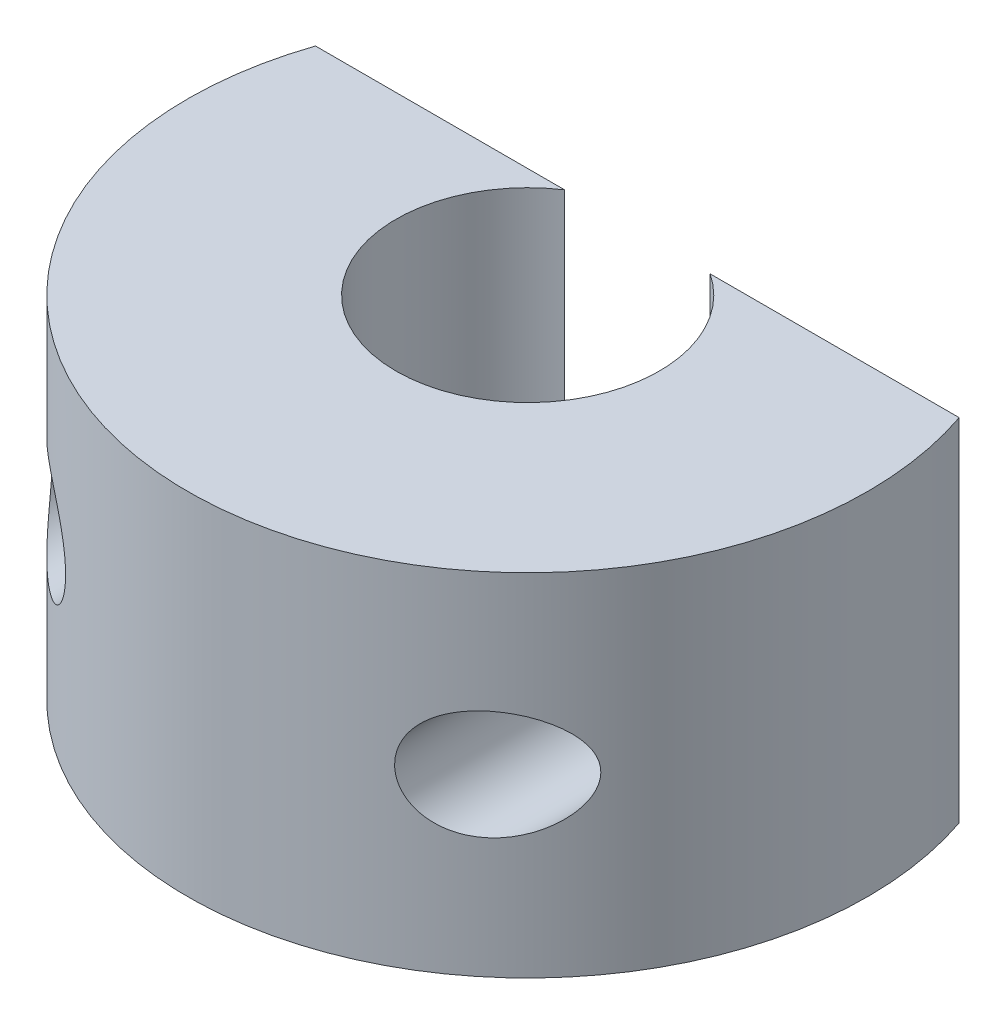
ISO-10303-21;
HEADER;
FILE_DESCRIPTION(('STEP AP214'),'2;1');
FILE_NAME('part.step','',(''),(''),'','','');
FILE_SCHEMA(('AUTOMOTIVE_DESIGN { 1 0 10303 214 1 1 1 1 }'));
ENDSEC;
DATA;
#1=APPLICATION_CONTEXT('core data for automotive mechanical design processes');
#2=APPLICATION_PROTOCOL_DEFINITION('international standard','automotive_design',2000,#1);
#3=PRODUCT_CONTEXT('',#1,'mechanical');
#4=PRODUCT('Part','Part','',(#3));
#5=PRODUCT_RELATED_PRODUCT_CATEGORY('part','',(#4));
#6=PRODUCT_DEFINITION_FORMATION('','',#4);
#7=PRODUCT_DEFINITION_CONTEXT('part definition',#1,'design');
#8=PRODUCT_DEFINITION('design','',#6,#7);
#9=PRODUCT_DEFINITION_SHAPE('','',#8);
#10=(LENGTH_UNIT() NAMED_UNIT(*) SI_UNIT(.MILLI.,.METRE.));
#11=(NAMED_UNIT(*) PLANE_ANGLE_UNIT() SI_UNIT($,.RADIAN.));
#12=(NAMED_UNIT(*) SI_UNIT($,.STERADIAN.) SOLID_ANGLE_UNIT());
#13=UNCERTAINTY_MEASURE_WITH_UNIT(LENGTH_MEASURE(1.E-05),#10,'distance_accuracy_value','');
#14=(GEOMETRIC_REPRESENTATION_CONTEXT(3) GLOBAL_UNCERTAINTY_ASSIGNED_CONTEXT((#13)) GLOBAL_UNIT_ASSIGNED_CONTEXT((#10,
#11,#12)) REPRESENTATION_CONTEXT('',''));
#15=CARTESIAN_POINT('',(0.,0.,0.));
#16=DIRECTION('',(0.,0.,1.));
#17=DIRECTION('',(1.,0.,0.));
#18=AXIS2_PLACEMENT_3D('',#15,#16,#17);
#19=CARTESIAN_POINT('',(0.,4.,0.));
#20=DIRECTION('',(0.,-1.,0.));
#21=DIRECTION('',(0.,0.,-1.));
#22=AXIS2_PLACEMENT_3D('',#19,#20,#21);
#23=CYLINDRICAL_SURFACE('',#22,3.);
#24=CARTESIAN_POINT('',(0.,-4.,0.));
#25=DIRECTION('',(0.,-1.,0.));
#26=DIRECTION('',(0.,0.,-1.));
#27=AXIS2_PLACEMENT_3D('',#24,#25,#26);
#28=CIRCLE('',#27,3.);
#29=CARTESIAN_POINT('',(1.6583123951777,-4.,-2.5));
#30=VERTEX_POINT('',#29);
#31=CARTESIAN_POINT('',(-1.6583123951777,-4.,-2.5));
#32=VERTEX_POINT('',#31);
#33=EDGE_CURVE('E102',#30,#32,#28,.T.);
#34=ORIENTED_EDGE('',*,*,#33,.T.);
#35=DIRECTION('',(0.,-1.,0.));
#36=VECTOR('',#35,1.);
#37=CARTESIAN_POINT('',(-1.6583123951777,4.,-2.5));
#38=LINE('',#37,#36);
#39=CARTESIAN_POINT('',(-1.6583123951777,4.,-2.5));
#40=VERTEX_POINT('',#39);
#41=EDGE_CURVE('E11',#40,#32,#38,.T.);
#42=ORIENTED_EDGE('',*,*,#41,.F.);
#43=CARTESIAN_POINT('',(0.,4.,0.));
#44=DIRECTION('',(0.,-1.,0.));
#45=DIRECTION('',(0.,0.,-1.));
#46=AXIS2_PLACEMENT_3D('',#43,#44,#45);
#47=CIRCLE('',#46,3.);
#48=CARTESIAN_POINT('',(1.6583123951777,4.,-2.5));
#49=VERTEX_POINT('',#48);
#50=EDGE_CURVE('E89',#49,#40,#47,.T.);
#51=ORIENTED_EDGE('',*,*,#50,.F.);
#52=DIRECTION('',(0.,-1.,0.));
#53=VECTOR('',#52,1.);
#54=CARTESIAN_POINT('',(1.6583123951777,4.,-2.5));
#55=LINE('',#54,#53);
#56=EDGE_CURVE('E98',#49,#30,#55,.T.);
#57=ORIENTED_EDGE('',*,*,#56,.T.);
#58=EDGE_LOOP('',(#34,#42,#51,#57));
#59=FACE_BOUND('',#58,.T.);
#60=ADVANCED_FACE('F32',(#59),#23,.F.);
#61=CARTESIAN_POINT('',(-7.3357003755606,4.,-2.5));
#62=DIRECTION('',(0.,0.,1.));
#63=DIRECTION('',(1.,0.,0.));
#64=AXIS2_PLACEMENT_3D('',#61,#62,#63);
#65=PLANE('',#64);
#66=CARTESIAN_POINT('',(-5.,0.,-2.49999999999999));
#67=DIRECTION('',(0.,0.,-1.));
#68=DIRECTION('',(-1.,0.,0.));
#69=AXIS2_PLACEMENT_3D('',#66,#67,#68);
#70=CIRCLE('',#69,1.25);
#71=CARTESIAN_POINT('',(-6.25,0.,-2.49999999999999));
#72=VERTEX_POINT('',#71);
#73=EDGE_CURVE('E152',#72,#72,#70,.T.);
#74=ORIENTED_EDGE('',*,*,#73,.F.);
#75=EDGE_LOOP('',(#74));
#76=FACE_BOUND('',#75,.T.);
#77=DIRECTION('',(-1.,0.,0.));
#78=VECTOR('',#77,1.);
#79=CARTESIAN_POINT('',(-7.3357003755606,-4.,-2.5));
#80=LINE('',#79,#78);
#81=CARTESIAN_POINT('',(-7.3357003755606,-4.,-2.5));
#82=VERTEX_POINT('',#81);
#83=EDGE_CURVE('E93',#32,#82,#80,.T.);
#84=ORIENTED_EDGE('',*,*,#83,.T.);
#85=DIRECTION('',(0.,-1.,0.));
#86=VECTOR('',#85,1.);
#87=CARTESIAN_POINT('',(-7.3357003755606,4.,-2.5));
#88=LINE('',#87,#86);
#89=CARTESIAN_POINT('',(-7.3357003755606,4.,-2.5));
#90=VERTEX_POINT('',#89);
#91=EDGE_CURVE('E46',#90,#82,#88,.T.);
#92=ORIENTED_EDGE('',*,*,#91,.F.);
#93=DIRECTION('',(-1.,0.,0.));
#94=VECTOR('',#93,1.);
#95=CARTESIAN_POINT('',(-7.3357003755606,4.,-2.5));
#96=LINE('',#95,#94);
#97=EDGE_CURVE('E84',#40,#90,#96,.T.);
#98=ORIENTED_EDGE('',*,*,#97,.F.);
#99=ORIENTED_EDGE('',*,*,#41,.T.);
#100=EDGE_LOOP('',(#84,#92,#98,#99));
#101=FACE_BOUND('',#100,.T.);
#102=ADVANCED_FACE('F92',(#76,#101),#65,.F.);
#103=CARTESIAN_POINT('',(0.,4.,0.));
#104=DIRECTION('',(0.,-1.,0.));
#105=DIRECTION('',(0.,0.,-1.));
#106=AXIS2_PLACEMENT_3D('',#103,#104,#105);
#107=CYLINDRICAL_SURFACE('',#106,7.75);
#108=CARTESIAN_POINT('',(-6.24999999999998,0.,4.58257569495586));
#109=CARTESIAN_POINT('',(-6.24999348131399,0.0518784505286491,4.58258596959199));
#110=CARTESIAN_POINT('',(-6.24672575964114,0.103834507761748,4.5870515929712));
#111=CARTESIAN_POINT('',(-6.23404836282178,0.205616398790831,4.60426372327501));
#112=CARTESIAN_POINT('',(-6.2246214928542,0.255435851542943,4.61703341263144));
#113=CARTESIAN_POINT('',(-6.20074872490045,0.350847579831287,4.64904316711789));
#114=CARTESIAN_POINT('',(-6.18636783356175,0.396485361119432,4.66819932895394));
#115=CARTESIAN_POINT('',(-6.15354462533785,0.483747388193636,4.71138278062297));
#116=CARTESIAN_POINT('',(-6.13510119479706,0.525370528947056,4.73541140599073));
#117=CARTESIAN_POINT('',(-6.08204151279849,0.630094409345745,4.8035528815806));
#118=CARTESIAN_POINT('',(-6.04464368115117,0.689829685807577,4.8506565678572));
#119=CARTESIAN_POINT('',(-5.96330384797375,0.799514725878446,4.95032279194121));
#120=CARTESIAN_POINT('',(-5.91934217858414,0.849433997928561,5.00290158694314));
#121=CARTESIAN_POINT('',(-5.80539971287597,0.960569664473887,5.13521488571973));
#122=CARTESIAN_POINT('',(-5.73255833618619,1.01689667031263,5.21660316322248));
#123=CARTESIAN_POINT('',(-5.57820700083539,1.11192793826317,5.38134888403433));
#124=CARTESIAN_POINT('',(-5.49668978787636,1.15061730759083,5.46470792917902));
#125=CARTESIAN_POINT('',(-5.32515429616678,1.21043634609709,5.63203457237981));
#126=CARTESIAN_POINT('',(-5.23501802658294,1.23126601826557,5.71598954788913));
#127=CARTESIAN_POINT('',(-5.04946736880331,1.25249486592818,5.88053408393343));
#128=CARTESIAN_POINT('',(-4.95406127316699,1.25292527346354,5.96112860040243));
#129=CARTESIAN_POINT('',(-4.78411575721415,1.2334347120905,6.09784127066877));
#130=CARTESIAN_POINT('',(-4.71002788616726,1.21834415752358,6.15521188109435));
#131=CARTESIAN_POINT('',(-4.56272055411748,1.17353903659263,6.26518008027035));
#132=CARTESIAN_POINT('',(-4.48950008703155,1.14384355814167,6.31778379313544));
#133=CARTESIAN_POINT('',(-4.35910748149482,1.07527457009441,6.4082664619563));
#134=CARTESIAN_POINT('',(-4.30133436958478,1.03884366081215,6.4471243471104));
#135=CARTESIAN_POINT('',(-4.19057204204312,0.955060482420551,6.51966112574256));
#136=CARTESIAN_POINT('',(-4.13758183353553,0.907710487277007,6.55334109512228));
#137=CARTESIAN_POINT('',(-4.03856198076861,0.802128348194479,6.6148278221365));
#138=CARTESIAN_POINT('',(-3.99258495380871,0.743820632113639,6.64259074901304));
#139=CARTESIAN_POINT('',(-3.91079427313457,0.617862647389335,6.69107329257094));
#140=CARTESIAN_POINT('',(-3.87497314626717,0.550219303088344,6.71179809044687));
#141=CARTESIAN_POINT('',(-3.81973884806655,0.41711957918556,6.7433654200403));
#142=CARTESIAN_POINT('',(-3.79880165444391,0.352514214235741,6.7551400953554));
#143=CARTESIAN_POINT('',(-3.76763232969829,0.21998596625801,6.77257503988251));
#144=CARTESIAN_POINT('',(-3.75739381720859,0.152065086148947,6.77823895400264));
#145=CARTESIAN_POINT('',(-3.74860273605602,0.0210817302038032,6.78310377586761));
#146=CARTESIAN_POINT('',(-3.74912981335819,-0.0419022935232698,6.78281368260992));
#147=CARTESIAN_POINT('',(-3.75959915108932,-0.166828701997003,6.77701630723716));
#148=CARTESIAN_POINT('',(-3.76953944182395,-0.228771301899678,6.77151011657898));
#149=CARTESIAN_POINT('',(-3.79810074300281,-0.348832996164666,6.75553029365578));
#150=CARTESIAN_POINT('',(-3.81657505624847,-0.406998463974556,6.74514055710462));
#151=CARTESIAN_POINT('',(-3.86129908636492,-0.51913948621786,6.7196375197341));
#152=CARTESIAN_POINT('',(-3.88754955924166,-0.573114632619843,6.7045237596326));
#153=CARTESIAN_POINT('',(-3.94791678932602,-0.677804998459077,6.66916191908254));
#154=CARTESIAN_POINT('',(-3.98231083177622,-0.728297312231079,6.64872949114416));
#155=CARTESIAN_POINT('',(-4.0568825433872,-0.822585463065061,6.60349182755109));
#156=CARTESIAN_POINT('',(-4.09706195985344,-0.866379268765291,6.5786852703065));
#157=CARTESIAN_POINT('',(-4.18582835636238,-0.950641831146005,6.52260282560698));
#158=CARTESIAN_POINT('',(-4.23485222267181,-0.990386866546587,6.49093436710892));
#159=CARTESIAN_POINT('',(-4.33633662245333,-1.0610757068237,6.42358156603592));
#160=CARTESIAN_POINT('',(-4.38879879469178,-1.09201527674953,6.38789530259072));
#161=CARTESIAN_POINT('',(-4.50371871062132,-1.14931551131954,6.30750647416195));
#162=CARTESIAN_POINT('',(-4.56648865038794,-1.17427706023345,6.26225641528283));
#163=CARTESIAN_POINT('',(-4.6927124600703,-1.21344507895881,6.16823813704715));
#164=CARTESIAN_POINT('',(-4.7561666955317,-1.2276454789062,6.11946794910899));
#165=CARTESIAN_POINT('',(-4.89475740770418,-1.24789531886117,6.00941936273959));
#166=CARTESIAN_POINT('',(-4.96974645106167,-1.25180217363835,5.94756265745263));
#167=CARTESIAN_POINT('',(-5.11708332795991,-1.2466894919788,5.82128881820314));
#168=CARTESIAN_POINT('',(-5.18942889275151,-1.23765910760702,5.75686957959407));
#169=CARTESIAN_POINT('',(-5.34467613964728,-1.20466531469705,5.61339891499954));
#170=CARTESIAN_POINT('',(-5.42672925025796,-1.1780365580987,5.53403804382119));
#171=CARTESIAN_POINT('',(-5.58390329780441,-1.10858143969382,5.37540607059785));
#172=CARTESIAN_POINT('',(-5.65901968273236,-1.06574453445464,5.29613506074619));
#173=CARTESIAN_POINT('',(-5.78836962359123,-0.97270984704147,5.15410929500014));
#174=CARTESIAN_POINT('',(-5.84395920096575,-0.925103937706332,5.0908877777489));
#175=CARTESIAN_POINT('',(-5.94809286924309,-0.818039597863168,4.96880944442077));
#176=CARTESIAN_POINT('',(-5.99665161254297,-0.758606448137781,4.90994367989049));
#177=CARTESIAN_POINT('',(-6.06828562282355,-0.65096798926542,4.82082871677357));
#178=CARTESIAN_POINT('',(-6.09414810819408,-0.606725865361038,4.7880414935909));
#179=CARTESIAN_POINT('',(-6.14125145529809,-0.51264396529222,4.72747202790552));
#180=CARTESIAN_POINT('',(-6.16249819618146,-0.462811433936382,4.69968342643227));
#181=CARTESIAN_POINT('',(-6.19501541796385,-0.369221463000907,4.65669930954048));
#182=CARTESIAN_POINT('',(-6.20745204528422,-0.32653223198729,4.64007845493334));
#183=CARTESIAN_POINT('',(-6.22789218799085,-0.238355838127029,4.61260838601768));
#184=CARTESIAN_POINT('',(-6.23590702934033,-0.192876158288566,4.60174442884046));
#185=CARTESIAN_POINT('',(-6.24422531550929,-0.122459492940085,4.59044351554807));
#186=CARTESIAN_POINT('',(-6.24638358726695,-0.0981183105327655,4.58750466242382));
#187=CARTESIAN_POINT('',(-6.24927265555726,-0.0491906109154349,4.583568070567));
#188=CARTESIAN_POINT('',(-6.25000309157203,-0.0246040333196238,4.58257082207537));
#189=CARTESIAN_POINT('',(-6.24999999999998,0.,4.58257569495586));
#190=B_SPLINE_CURVE_WITH_KNOTS('',3,(#108,#109,#110,#111,#112,#113,#114,#115,#116,#117,#118,
#119,#120,#121,#122,#123,#124,#125,#126,#127,#128,#129,#130,#131,#132,#133,#134,#135,#136,#137,
#138,#139,#140,#141,#142,#143,#144,#145,#146,#147,#148,#149,#150,#151,#152,#153,#154,#155,#156,
#157,#158,#159,#160,#161,#162,#163,#164,#165,#166,#167,#168,#169,#170,#171,#172,#173,#174,#175,
#176,#177,#178,#179,#180,#181,#182,#183,#184,#185,#186,#187,#188,#189),.UNSPECIFIED.,.T.,.F.,(4,
2,2,2,2,2,2,2,2,2,2,2,2,2,2,2,2,2,2,2,2,2,2,2,2,2,2,2,2,2,2,2,2,2,2,2,2,2,2,2,4),(0.,
0.155502365075814,0.311440720075636,0.465406234459781,0.61941400773896,0.872287647875051,
1.12593479617613,1.49269455251444,1.85976342072319,2.23288363973287,2.60543257917322,
2.8891083731,3.17241439808335,3.40720432228499,3.64194539414985,3.87836913033981,
4.11461844143583,4.32027607416537,4.52581096959871,4.71385427440103,4.90185824024531,
5.08674430086966,5.27164834220259,5.46409770979151,5.65660532355841,5.8676086409519,
6.07871326864939,6.32172876705703,6.5648812373959,6.85568227701701,7.14672729742231,
7.49701151490504,7.84752398580156,8.13682482785187,8.42551380465942,8.60755472882641,
8.78936240704442,8.9312547018302,9.07278184601114,9.14651226140281,9.22026129077085),.UNSPECIFIED.);
#191=CARTESIAN_POINT('',(-6.24999999999998,0.,4.58257569495586));
#192=VERTEX_POINT('',#191);
#193=EDGE_CURVE('E35',#192,#192,#190,.T.);
#194=ORIENTED_EDGE('',*,*,#193,.T.);
#195=EDGE_LOOP('',(#194));
#196=FACE_BOUND('',#195,.T.);
#197=CARTESIAN_POINT('',(3.75000000000002,0.,6.78232998312526));
#198=CARTESIAN_POINT('',(3.7500034351103,0.0631780241832544,6.78232890638174));
#199=CARTESIAN_POINT('',(3.75481556099499,0.126403745064957,6.779674321555));
#200=CARTESIAN_POINT('',(3.77383809885306,0.251018149620008,6.76910326377482));
#201=CARTESIAN_POINT('',(3.78805993829679,0.312404504637196,6.76118039278017));
#202=CARTESIAN_POINT('',(3.82515857121502,0.431419495015327,6.74026041725285));
#203=CARTESIAN_POINT('',(3.84801514806034,0.48905654200438,6.72727516309434));
#204=CARTESIAN_POINT('',(3.90131454479134,0.599283096117829,6.69650557537078));
#205=CARTESIAN_POINT('',(3.93175640796059,0.651873238640022,6.67872184700391));
#206=CARTESIAN_POINT('',(4.00013465958023,0.752737034265601,6.63800093464253));
#207=CARTESIAN_POINT('',(4.038299737934,0.800789664398267,6.61490248622091));
#208=CARTESIAN_POINT('',(4.11984697442647,0.889647104636092,6.56442383281192));
#209=CARTESIAN_POINT('',(4.16323085839696,0.930449506017662,6.53704221049723));
#210=CARTESIAN_POINT('',(4.25875167719187,1.00859736797835,6.47526904129778));
#211=CARTESIAN_POINT('',(4.31132574099154,1.04505742847637,6.44043683985124));
#212=CARTESIAN_POINT('',(4.41926102050589,1.10868119014061,6.36686009624791));
#213=CARTESIAN_POINT('',(4.47462373895318,1.1358398161823,6.3281134331331));
#214=CARTESIAN_POINT('',(4.59582854876424,1.1849443550397,6.24077751866));
#215=CARTESIAN_POINT('',(4.66189929301982,1.20530321813724,6.19161655993025));
#216=CARTESIAN_POINT('',(4.79394248507944,1.23475658397653,6.08995729230447));
#217=CARTESIAN_POINT('',(4.85991486623691,1.24384538228079,6.03745730745396));
#218=CARTESIAN_POINT('',(5.00370143621852,1.2524670411477,5.91910411353484));
#219=CARTESIAN_POINT('',(5.08120267044671,1.24968711505115,5.85270270540288));
#220=CARTESIAN_POINT('',(5.23262223859852,1.23053746095967,5.71773444364473));
#221=CARTESIAN_POINT('',(5.30653603843569,1.21415098619803,5.64916502174473));
#222=CARTESIAN_POINT('',(5.46348144900408,1.16435423532565,5.49790128084132));
#223=CARTESIAN_POINT('',(5.54550915112644,1.12826301317546,5.41504163740488));
#224=CARTESIAN_POINT('',(5.70122786848565,1.03868110063621,5.25083415645747));
#225=CARTESIAN_POINT('',(5.77492271315324,0.985198446776031,5.16948563897907));
#226=CARTESIAN_POINT('',(5.88943718436384,0.880502173408234,5.03805279883321));
#227=CARTESIAN_POINT('',(5.93311606038049,0.834288497062645,4.98645909622493));
#228=CARTESIAN_POINT('',(6.01471497689335,0.732859951363244,4.8877159897183));
#229=CARTESIAN_POINT('',(6.05264508999953,0.6776611855816,4.84055886864453));
#230=CARTESIAN_POINT('',(6.11072220874189,0.575444846022552,4.76687347472019));
#231=CARTESIAN_POINT('',(6.13279142476366,0.530935844033735,4.73839916504163));
#232=CARTESIAN_POINT('',(6.17224962639602,0.436941102108549,4.6868841062186));
#233=CARTESIAN_POINT('',(6.18964615612049,0.387463563586837,4.66383460618658));
#234=CARTESIAN_POINT('',(6.21540775936884,0.295067336267445,4.62942430027453));
#235=CARTESIAN_POINT('',(6.22490901513615,0.253012238488574,4.61661752537685));
#236=CARTESIAN_POINT('',(6.2395846557809,0.166834113311011,4.59676391357954));
#237=CARTESIAN_POINT('',(6.24476371009535,0.122713372088622,4.58971086090298));
#238=CARTESIAN_POINT('',(6.25035830451172,0.0333832599660972,4.58208971837123));
#239=CARTESIAN_POINT('',(6.25075097368173,-0.0118303041397979,4.58155276464692));
#240=CARTESIAN_POINT('',(6.24667313001235,-0.101628268135779,4.58711075689094));
#241=CARTESIAN_POINT('',(6.24220074359177,-0.146212418932316,4.59320825785384));
#242=CARTESIAN_POINT('',(6.22923794214583,-0.230614056155551,4.61077013643047));
#243=CARTESIAN_POINT('',(6.22102323360485,-0.270553944434547,4.62186574553629));
#244=CARTESIAN_POINT('',(6.20123027519721,-0.348063822048441,4.64838871505103));
#245=CARTESIAN_POINT('',(6.18965070908608,-0.385632876961902,4.66381777051191));
#246=CARTESIAN_POINT('',(6.15561083859174,-0.480576409771497,4.70873169577356));
#247=CARTESIAN_POINT('',(6.13085330808534,-0.53580685185231,4.74100367743841));
#248=CARTESIAN_POINT('',(6.07574368568584,-0.639322844005436,4.81143004131079));
#249=CARTESIAN_POINT('',(6.04537369166449,-0.687585264935705,4.84960318093009));
#250=CARTESIAN_POINT('',(5.96274860623212,-0.801825616951281,4.95119960324746));
#251=CARTESIAN_POINT('',(5.90750695584884,-0.863374069333912,5.01716256639357));
#252=CARTESIAN_POINT('',(5.7892352936248,-0.972672153652057,5.15319735172237));
#253=CARTESIAN_POINT('',(5.72619800521596,-1.02040875249006,5.22327298018775));
#254=CARTESIAN_POINT('',(5.59080788140335,-1.10456324122059,5.36801561214055));
#255=CARTESIAN_POINT('',(5.51817141795581,-1.14040768175242,5.44275061571604));
#256=CARTESIAN_POINT('',(5.36700393964807,-1.19763949156446,5.59187477278078));
#257=CARTESIAN_POINT('',(5.28846916127906,-1.21901754176845,5.66626367273453));
#258=CARTESIAN_POINT('',(5.11254690417546,-1.24865251938571,5.82587373074605));
#259=CARTESIAN_POINT('',(5.01427197541157,-1.25394278842972,5.91070071059696));
#260=CARTESIAN_POINT('',(4.814556561675,-1.24019043524375,6.0744622040198));
#261=CARTESIAN_POINT('',(4.71312368603911,-1.22120246326,6.15340952988669));
#262=CARTESIAN_POINT('',(4.54697598780009,-1.16707397139421,6.27648691799447));
#263=CARTESIAN_POINT('',(4.48164057604422,-1.1397432999317,6.32324752618089));
#264=CARTESIAN_POINT('',(4.35402948375687,-1.0725712806562,6.41178033522965));
#265=CARTESIAN_POINT('',(4.29175191991167,-1.03273774796303,6.45355562979234));
#266=CARTESIAN_POINT('',(4.17248641639071,-0.939934676174024,6.53130747758314));
#267=CARTESIAN_POINT('',(4.11554843113991,-0.886855392314863,6.56723121784042));
#268=CARTESIAN_POINT('',(4.01091286589361,-0.768394667035566,6.63165611446733));
#269=CARTESIAN_POINT('',(3.96320959933048,-0.703020845577217,6.6601618424578));
#270=CARTESIAN_POINT('',(3.88641716493085,-0.572137989450252,6.70521892309393));
#271=CARTESIAN_POINT('',(3.8556357267707,-0.508007975846293,6.72290139098207));
#272=CARTESIAN_POINT('',(3.80519592565508,-0.374200361184932,6.75158035546593));
#273=CARTESIAN_POINT('',(3.78551231077135,-0.304535769297243,6.76259203502772));
#274=CARTESIAN_POINT('',(3.76469873175482,-0.19509573727517,6.77418667412142));
#275=CARTESIAN_POINT('',(3.75919866213883,-0.156351193479493,6.77723709724284));
#276=CARTESIAN_POINT('',(3.751848359177,-0.0784105370114023,6.78130901420132));
#277=CARTESIAN_POINT('',(3.74999786783485,-0.0392144564561134,6.78233065145752));
#278=CARTESIAN_POINT('',(3.75000000000002,0.,6.78232998312526));
#279=B_SPLINE_CURVE_WITH_KNOTS('',3,(#197,#198,#199,#200,#201,#202,#203,#204,#205,#206,#207,
#208,#209,#210,#211,#212,#213,#214,#215,#216,#217,#218,#219,#220,#221,#222,#223,#224,#225,#226,
#227,#228,#229,#230,#231,#232,#233,#234,#235,#236,#237,#238,#239,#240,#241,#242,#243,#244,#245,
#246,#247,#248,#249,#250,#251,#252,#253,#254,#255,#256,#257,#258,#259,#260,#261,#262,#263,#264,
#265,#266,#267,#268,#269,#270,#271,#272,#273,#274,#275,#276,#277,#278),.UNSPECIFIED.,.T.,.F.,(4,
2,2,2,2,2,2,2,2,2,2,2,2,2,2,2,2,2,2,2,2,2,2,2,2,2,2,2,2,2,2,2,2,2,2,2,2,2,2,2,4),(0.,
0.189382232570923,0.378994880438303,0.568166309655793,0.757313891139653,0.953211666913891,
1.14917440407701,1.36687261066759,1.58468941099508,1.83825448132922,2.09194784342285,
2.39711013929545,2.70264858271721,3.06731978365911,3.43182271002196,3.67687637678481,
3.92149558524308,4.09277770097105,4.26378159416636,4.3981753161687,4.53242365892807,
4.66731323461218,4.80225477600706,4.92855318754888,5.05490107039353,5.25949894395597,
5.46476105668436,5.78040110369506,6.09633802978712,6.42582909749901,6.75553221788438,
7.14318536677916,7.5299674438964,7.78361162218807,8.03709757067336,8.29275782258753,
8.5482601393868,8.76691682074101,8.98507394289033,9.10263137620587,9.22018049884339),.UNSPECIFIED.);
#280=CARTESIAN_POINT('',(3.75000000000002,0.,6.78232998312526));
#281=VERTEX_POINT('',#280);
#282=EDGE_CURVE('E105',#281,#281,#279,.T.);
#283=ORIENTED_EDGE('',*,*,#282,.T.);
#284=EDGE_LOOP('',(#283));
#285=FACE_BOUND('',#284,.T.);
#286=CARTESIAN_POINT('',(0.,-4.,0.));
#287=DIRECTION('',(0.,1.,0.));
#288=DIRECTION('',(0.,0.,1.));
#289=AXIS2_PLACEMENT_3D('',#286,#287,#288);
#290=CIRCLE('',#289,7.75);
#291=CARTESIAN_POINT('',(7.3357003755606,-4.,-2.5));
#292=VERTEX_POINT('',#291);
#293=EDGE_CURVE('E71',#82,#292,#290,.T.);
#294=ORIENTED_EDGE('',*,*,#293,.T.);
#295=DIRECTION('',(0.,-1.,0.));
#296=VECTOR('',#295,1.);
#297=CARTESIAN_POINT('',(7.3357003755606,4.,-2.5));
#298=LINE('',#297,#296);
#299=CARTESIAN_POINT('',(7.3357003755606,4.,-2.5));
#300=VERTEX_POINT('',#299);
#301=EDGE_CURVE('E94',#300,#292,#298,.T.);
#302=ORIENTED_EDGE('',*,*,#301,.F.);
#303=CARTESIAN_POINT('',(0.,4.,0.));
#304=DIRECTION('',(0.,1.,0.));
#305=DIRECTION('',(0.,0.,1.));
#306=AXIS2_PLACEMENT_3D('',#303,#304,#305);
#307=CIRCLE('',#306,7.75);
#308=EDGE_CURVE('E87',#90,#300,#307,.T.);
#309=ORIENTED_EDGE('',*,*,#308,.F.);
#310=ORIENTED_EDGE('',*,*,#91,.T.);
#311=EDGE_LOOP('',(#294,#302,#309,#310));
#312=FACE_BOUND('',#311,.T.);
#313=ADVANCED_FACE('F96',(#196,#285,#312),#107,.T.);
#314=CARTESIAN_POINT('',(1.6583123951777,4.,-2.5));
#315=DIRECTION('',(0.,0.,1.));
#316=DIRECTION('',(1.,0.,0.));
#317=AXIS2_PLACEMENT_3D('',#314,#315,#316);
#318=PLANE('',#317);
#319=CARTESIAN_POINT('',(5.,0.,-2.50000000000001));
#320=DIRECTION('',(0.,0.,-1.));
#321=DIRECTION('',(-1.,0.,0.));
#322=AXIS2_PLACEMENT_3D('',#319,#320,#321);
#323=CIRCLE('',#322,1.25);
#324=CARTESIAN_POINT('',(3.75,0.,-2.50000000000001));
#325=VERTEX_POINT('',#324);
#326=EDGE_CURVE('E122',#325,#325,#323,.T.);
#327=ORIENTED_EDGE('',*,*,#326,.F.);
#328=EDGE_LOOP('',(#327));
#329=FACE_BOUND('',#328,.T.);
#330=DIRECTION('',(-1.,0.,0.));
#331=VECTOR('',#330,1.);
#332=CARTESIAN_POINT('',(1.6583123951777,-4.,-2.5));
#333=LINE('',#332,#331);
#334=EDGE_CURVE('E77',#292,#30,#333,.T.);
#335=ORIENTED_EDGE('',*,*,#334,.T.);
#336=ORIENTED_EDGE('',*,*,#56,.F.);
#337=DIRECTION('',(-1.,0.,0.));
#338=VECTOR('',#337,1.);
#339=CARTESIAN_POINT('',(1.6583123951777,4.,-2.5));
#340=LINE('',#339,#338);
#341=EDGE_CURVE('E54',#300,#49,#340,.T.);
#342=ORIENTED_EDGE('',*,*,#341,.F.);
#343=ORIENTED_EDGE('',*,*,#301,.T.);
#344=EDGE_LOOP('',(#335,#336,#342,#343));
#345=FACE_BOUND('',#344,.T.);
#346=ADVANCED_FACE('F110',(#329,#345),#318,.F.);
#347=CARTESIAN_POINT('',(0.,4.,0.));
#348=DIRECTION('',(0.,-1.,0.));
#349=DIRECTION('',(0.,0.,-1.));
#350=AXIS2_PLACEMENT_3D('',#347,#348,#349);
#351=PLANE('',#350);
#352=ORIENTED_EDGE('',*,*,#50,.T.);
#353=ORIENTED_EDGE('',*,*,#97,.T.);
#354=ORIENTED_EDGE('',*,*,#308,.T.);
#355=ORIENTED_EDGE('',*,*,#341,.T.);
#356=EDGE_LOOP('',(#352,#353,#354,#355));
#357=FACE_BOUND('',#356,.T.);
#358=ADVANCED_FACE('F85',(#357),#351,.F.);
#359=CARTESIAN_POINT('',(0.,-4.,0.));
#360=DIRECTION('',(0.,-1.,0.));
#361=DIRECTION('',(0.,0.,-1.));
#362=AXIS2_PLACEMENT_3D('',#359,#360,#361);
#363=PLANE('',#362);
#364=ORIENTED_EDGE('',*,*,#33,.F.);
#365=ORIENTED_EDGE('',*,*,#334,.F.);
#366=ORIENTED_EDGE('',*,*,#293,.F.);
#367=ORIENTED_EDGE('',*,*,#83,.F.);
#368=EDGE_LOOP('',(#364,#365,#366,#367));
#369=FACE_BOUND('',#368,.T.);
#370=ADVANCED_FACE('F113',(#369),#363,.T.);
#371=CARTESIAN_POINT('',(5.00000000000002,0.,7.75000000000001));
#372=DIRECTION('',(0.,0.,-1.));
#373=DIRECTION('',(-1.,0.,0.));
#374=AXIS2_PLACEMENT_3D('',#371,#372,#373);
#375=CYLINDRICAL_SURFACE('',#374,1.25);
#376=ORIENTED_EDGE('',*,*,#326,.T.);
#377=EDGE_LOOP('',(#376));
#378=FACE_BOUND('',#377,.T.);
#379=ORIENTED_EDGE('',*,*,#282,.F.);
#380=EDGE_LOOP('',(#379));
#381=FACE_BOUND('',#380,.T.);
#382=ADVANCED_FACE('F126',(#378,#381),#375,.F.);
#383=CARTESIAN_POINT('',(-4.99999999999998,0.,7.75000000000003));
#384=DIRECTION('',(0.,0.,-1.));
#385=DIRECTION('',(-1.,0.,0.));
#386=AXIS2_PLACEMENT_3D('',#383,#384,#385);
#387=CYLINDRICAL_SURFACE('',#386,1.25);
#388=ORIENTED_EDGE('',*,*,#73,.T.);
#389=EDGE_LOOP('',(#388));
#390=FACE_BOUND('',#389,.T.);
#391=ORIENTED_EDGE('',*,*,#193,.F.);
#392=EDGE_LOOP('',(#391));
#393=FACE_BOUND('',#392,.T.);
#394=ADVANCED_FACE('F130',(#390,#393),#387,.F.);
#395=CLOSED_SHELL('',(#60,#102,#313,#346,#358,#370,#382,#394));
#396=MANIFOLD_SOLID_BREP('B2',#395);
#397=ADVANCED_BREP_SHAPE_REPRESENTATION('',(#18,#396),#14);
#398=SHAPE_DEFINITION_REPRESENTATION(#9,#397);
ENDSEC;
END-ISO-10303-21;
